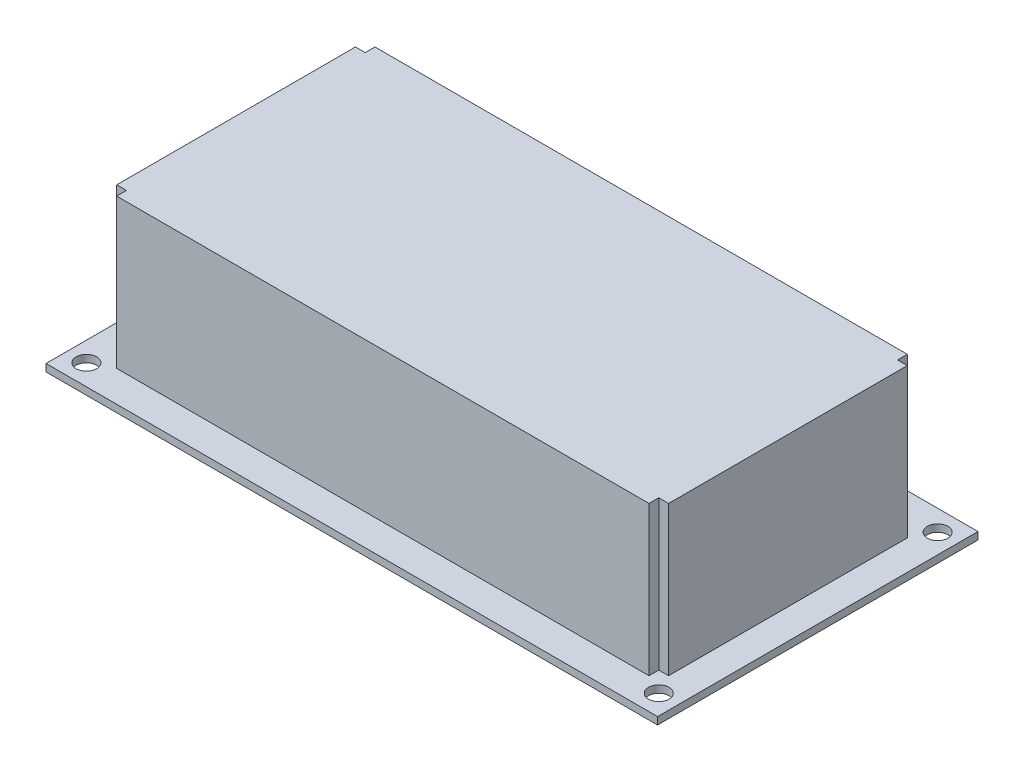
ISO-10303-21;
HEADER;
FILE_DESCRIPTION(('STEP AP214'),'2;1');
FILE_NAME('part.step','',(''),(''),'','','');
FILE_SCHEMA(('AUTOMOTIVE_DESIGN { 1 0 10303 214 1 1 1 1 }'));
ENDSEC;
DATA;
#1=APPLICATION_CONTEXT('core data for automotive mechanical design processes');
#2=APPLICATION_PROTOCOL_DEFINITION('international standard','automotive_design',2000,#1);
#3=PRODUCT_CONTEXT('',#1,'mechanical');
#4=PRODUCT('Part','Part','',(#3));
#5=PRODUCT_RELATED_PRODUCT_CATEGORY('part','',(#4));
#6=PRODUCT_DEFINITION_FORMATION('','',#4);
#7=PRODUCT_DEFINITION_CONTEXT('part definition',#1,'design');
#8=PRODUCT_DEFINITION('design','',#6,#7);
#9=PRODUCT_DEFINITION_SHAPE('','',#8);
#10=(LENGTH_UNIT() NAMED_UNIT(*) SI_UNIT(.MILLI.,.METRE.));
#11=(NAMED_UNIT(*) PLANE_ANGLE_UNIT() SI_UNIT($,.RADIAN.));
#12=(NAMED_UNIT(*) SI_UNIT($,.STERADIAN.) SOLID_ANGLE_UNIT());
#13=UNCERTAINTY_MEASURE_WITH_UNIT(LENGTH_MEASURE(1.E-05),#10,'distance_accuracy_value','');
#14=(GEOMETRIC_REPRESENTATION_CONTEXT(3) GLOBAL_UNCERTAINTY_ASSIGNED_CONTEXT((#13)) GLOBAL_UNIT_ASSIGNED_CONTEXT((#10,
#11,#12)) REPRESENTATION_CONTEXT('',''));
#15=CARTESIAN_POINT('',(0.,0.,0.));
#16=DIRECTION('',(0.,0.,1.));
#17=DIRECTION('',(1.,0.,0.));
#18=AXIS2_PLACEMENT_3D('',#15,#16,#17);
#19=CARTESIAN_POINT('',(0.,1.5,0.));
#20=DIRECTION('',(0.,-1.,0.));
#21=DIRECTION('',(0.,0.,-1.));
#22=AXIS2_PLACEMENT_3D('',#19,#20,#21);
#23=PLANE('',#22);
#24=CARTESIAN_POINT('',(-58.5,1.5,28.5));
#25=DIRECTION('',(0.,1.,0.));
#26=DIRECTION('',(0.,0.,1.));
#27=AXIS2_PLACEMENT_3D('',#24,#25,#26);
#28=CIRCLE('',#27,2.1);
#29=CARTESIAN_POINT('',(-58.5,1.5,30.6));
#30=VERTEX_POINT('',#29);
#31=EDGE_CURVE('E169',#30,#30,#28,.T.);
#32=ORIENTED_EDGE('',*,*,#31,.F.);
#33=EDGE_LOOP('',(#32));
#34=FACE_BOUND('',#33,.T.);
#35=CARTESIAN_POINT('',(58.5,1.5,28.5));
#36=DIRECTION('',(0.,1.,0.));
#37=DIRECTION('',(0.,0.,1.));
#38=AXIS2_PLACEMENT_3D('',#35,#36,#37);
#39=CIRCLE('',#38,2.1);
#40=CARTESIAN_POINT('',(58.5,1.5,30.6));
#41=VERTEX_POINT('',#40);
#42=EDGE_CURVE('E192',#41,#41,#39,.T.);
#43=ORIENTED_EDGE('',*,*,#42,.F.);
#44=EDGE_LOOP('',(#43));
#45=FACE_BOUND('',#44,.T.);
#46=DIRECTION('',(0.,0.,-1.));
#47=VECTOR('',#46,1.);
#48=CARTESIAN_POINT('',(62.5,1.5,32.75));
#49=LINE('',#48,#47);
#50=CARTESIAN_POINT('',(62.5,1.5,32.75));
#51=VERTEX_POINT('',#50);
#52=CARTESIAN_POINT('',(62.5,1.5,-32.75));
#53=VERTEX_POINT('',#52);
#54=EDGE_CURVE('E199',#51,#53,#49,.T.);
#55=ORIENTED_EDGE('',*,*,#54,.T.);
#56=DIRECTION('',(-1.,0.,0.));
#57=VECTOR('',#56,1.);
#58=CARTESIAN_POINT('',(-62.5,1.5,-32.75));
#59=LINE('',#58,#57);
#60=CARTESIAN_POINT('',(-62.5,1.5,-32.75));
#61=VERTEX_POINT('',#60);
#62=EDGE_CURVE('E202',#53,#61,#59,.T.);
#63=ORIENTED_EDGE('',*,*,#62,.T.);
#64=DIRECTION('',(0.,0.,1.));
#65=VECTOR('',#64,1.);
#66=CARTESIAN_POINT('',(-62.5,1.5,32.75));
#67=LINE('',#66,#65);
#68=CARTESIAN_POINT('',(-62.5,1.5,32.75));
#69=VERTEX_POINT('',#68);
#70=EDGE_CURVE('E205',#61,#69,#67,.T.);
#71=ORIENTED_EDGE('',*,*,#70,.T.);
#72=DIRECTION('',(1.,0.,0.));
#73=VECTOR('',#72,1.);
#74=CARTESIAN_POINT('',(-62.5,1.5,32.75));
#75=LINE('',#74,#73);
#76=EDGE_CURVE('E207',#69,#51,#75,.T.);
#77=ORIENTED_EDGE('',*,*,#76,.T.);
#78=EDGE_LOOP('',(#55,#63,#71,#77));
#79=FACE_BOUND('',#78,.T.);
#80=CARTESIAN_POINT('',(58.5,1.5,-28.5));
#81=DIRECTION('',(0.,1.,0.));
#82=DIRECTION('',(0.,0.,1.));
#83=AXIS2_PLACEMENT_3D('',#80,#81,#82);
#84=CIRCLE('',#83,2.1);
#85=CARTESIAN_POINT('',(58.5,1.5,-26.4));
#86=VERTEX_POINT('',#85);
#87=EDGE_CURVE('E186',#86,#86,#84,.T.);
#88=ORIENTED_EDGE('',*,*,#87,.F.);
#89=EDGE_LOOP('',(#88));
#90=FACE_BOUND('',#89,.T.);
#91=CARTESIAN_POINT('',(-58.5,1.5,-28.5));
#92=DIRECTION('',(0.,1.,0.));
#93=DIRECTION('',(0.,0.,1.));
#94=AXIS2_PLACEMENT_3D('',#91,#92,#93);
#95=CIRCLE('',#94,2.1);
#96=CARTESIAN_POINT('',(-58.5,1.5,-26.4));
#97=VERTEX_POINT('',#96);
#98=EDGE_CURVE('E180',#97,#97,#95,.T.);
#99=ORIENTED_EDGE('',*,*,#98,.F.);
#100=EDGE_LOOP('',(#99));
#101=FACE_BOUND('',#100,.T.);
#102=DIRECTION('',(0.,0.,-1.));
#103=VECTOR('',#102,1.);
#104=CARTESIAN_POINT('',(56.4,1.5,24.4));
#105=LINE('',#104,#103);
#106=CARTESIAN_POINT('',(56.4,1.5,24.4));
#107=VERTEX_POINT('',#106);
#108=CARTESIAN_POINT('',(56.4,1.5,-24.4));
#109=VERTEX_POINT('',#108);
#110=EDGE_CURVE('E168',#107,#109,#105,.T.);
#111=ORIENTED_EDGE('',*,*,#110,.F.);
#112=DIRECTION('',(1.,0.,0.));
#113=VECTOR('',#112,1.);
#114=CARTESIAN_POINT('',(56.4,1.5,24.4));
#115=LINE('',#114,#113);
#116=CARTESIAN_POINT('',(54.4,1.5,24.4));
#117=VERTEX_POINT('',#116);
#118=EDGE_CURVE('E165',#117,#107,#115,.T.);
#119=ORIENTED_EDGE('',*,*,#118,.F.);
#120=DIRECTION('',(0.,0.,-1.));
#121=VECTOR('',#120,1.);
#122=CARTESIAN_POINT('',(54.4,1.5,24.4));
#123=LINE('',#122,#121);
#124=CARTESIAN_POINT('',(54.4,1.5,26.4));
#125=VERTEX_POINT('',#124);
#126=EDGE_CURVE('E463',#125,#117,#123,.T.);
#127=ORIENTED_EDGE('',*,*,#126,.F.);
#128=DIRECTION('',(1.,0.,0.));
#129=VECTOR('',#128,1.);
#130=CARTESIAN_POINT('',(-54.4,1.5,26.4));
#131=LINE('',#130,#129);
#132=CARTESIAN_POINT('',(-54.4,1.5,26.4));
#133=VERTEX_POINT('',#132);
#134=EDGE_CURVE('E518',#133,#125,#131,.T.);
#135=ORIENTED_EDGE('',*,*,#134,.F.);
#136=DIRECTION('',(0.,0.,1.));
#137=VECTOR('',#136,1.);
#138=CARTESIAN_POINT('',(-54.4,1.5,24.4));
#139=LINE('',#138,#137);
#140=CARTESIAN_POINT('',(-54.4,1.5,24.4));
#141=VERTEX_POINT('',#140);
#142=EDGE_CURVE('E515',#141,#133,#139,.T.);
#143=ORIENTED_EDGE('',*,*,#142,.F.);
#144=DIRECTION('',(1.,0.,0.));
#145=VECTOR('',#144,1.);
#146=CARTESIAN_POINT('',(-56.4,1.5,24.4));
#147=LINE('',#146,#145);
#148=CARTESIAN_POINT('',(-56.4,1.5,24.4));
#149=VERTEX_POINT('',#148);
#150=EDGE_CURVE('E512',#149,#141,#147,.T.);
#151=ORIENTED_EDGE('',*,*,#150,.F.);
#152=DIRECTION('',(0.,0.,1.));
#153=VECTOR('',#152,1.);
#154=CARTESIAN_POINT('',(-56.4,1.5,24.4));
#155=LINE('',#154,#153);
#156=CARTESIAN_POINT('',(-56.4,1.5,-24.4));
#157=VERTEX_POINT('',#156);
#158=EDGE_CURVE('E509',#157,#149,#155,.T.);
#159=ORIENTED_EDGE('',*,*,#158,.F.);
#160=DIRECTION('',(-1.,0.,0.));
#161=VECTOR('',#160,1.);
#162=CARTESIAN_POINT('',(-56.4,1.5,-24.4));
#163=LINE('',#162,#161);
#164=CARTESIAN_POINT('',(-54.4,1.5,-24.4));
#165=VERTEX_POINT('',#164);
#166=EDGE_CURVE('E506',#165,#157,#163,.T.);
#167=ORIENTED_EDGE('',*,*,#166,.F.);
#168=DIRECTION('',(0.,0.,1.));
#169=VECTOR('',#168,1.);
#170=CARTESIAN_POINT('',(-54.4,1.5,-24.4));
#171=LINE('',#170,#169);
#172=CARTESIAN_POINT('',(-54.4,1.5,-26.4));
#173=VERTEX_POINT('',#172);
#174=EDGE_CURVE('E499',#173,#165,#171,.T.);
#175=ORIENTED_EDGE('',*,*,#174,.F.);
#176=DIRECTION('',(-1.,0.,0.));
#177=VECTOR('',#176,1.);
#178=CARTESIAN_POINT('',(-54.4,1.5,-26.4));
#179=LINE('',#178,#177);
#180=CARTESIAN_POINT('',(54.4,1.5,-26.4));
#181=VERTEX_POINT('',#180);
#182=EDGE_CURVE('E496',#181,#173,#179,.T.);
#183=ORIENTED_EDGE('',*,*,#182,.F.);
#184=DIRECTION('',(0.,0.,-1.));
#185=VECTOR('',#184,1.);
#186=CARTESIAN_POINT('',(54.4,1.5,-24.4));
#187=LINE('',#186,#185);
#188=CARTESIAN_POINT('',(54.4,1.5,-24.4));
#189=VERTEX_POINT('',#188);
#190=EDGE_CURVE('E55',#189,#181,#187,.T.);
#191=ORIENTED_EDGE('',*,*,#190,.F.);
#192=DIRECTION('',(-1.,0.,0.));
#193=VECTOR('',#192,1.);
#194=CARTESIAN_POINT('',(56.4,1.5,-24.4));
#195=LINE('',#194,#193);
#196=EDGE_CURVE('E50',#109,#189,#195,.T.);
#197=ORIENTED_EDGE('',*,*,#196,.F.);
#198=EDGE_LOOP('',(#111,#119,#127,#135,#143,#151,#159,#167,#175,#183,#191,#197));
#199=FACE_BOUND('',#198,.T.);
#200=ADVANCED_FACE('F35',(#34,#45,#79,#90,#101,#199),#23,.F.);
#201=CARTESIAN_POINT('',(62.5,1.5,32.75));
#202=DIRECTION('',(-1.,0.,0.));
#203=DIRECTION('',(0.,0.,1.));
#204=AXIS2_PLACEMENT_3D('',#201,#202,#203);
#205=PLANE('',#204);
#206=DIRECTION('',(0.,0.,-1.));
#207=VECTOR('',#206,1.);
#208=CARTESIAN_POINT('',(62.5,0.,32.75));
#209=LINE('',#208,#207);
#210=CARTESIAN_POINT('',(62.5,0.,32.75));
#211=VERTEX_POINT('',#210);
#212=CARTESIAN_POINT('',(62.5,0.,-32.75));
#213=VERTEX_POINT('',#212);
#214=EDGE_CURVE('E198',#211,#213,#209,.T.);
#215=ORIENTED_EDGE('',*,*,#214,.T.);
#216=DIRECTION('',(0.,-1.,0.));
#217=VECTOR('',#216,1.);
#218=CARTESIAN_POINT('',(62.5,1.5,-32.75));
#219=LINE('',#218,#217);
#220=EDGE_CURVE('E11',#53,#213,#219,.T.);
#221=ORIENTED_EDGE('',*,*,#220,.F.);
#222=ORIENTED_EDGE('',*,*,#54,.F.);
#223=DIRECTION('',(0.,-1.,0.));
#224=VECTOR('',#223,1.);
#225=CARTESIAN_POINT('',(62.5,1.5,32.75));
#226=LINE('',#225,#224);
#227=EDGE_CURVE('E209',#51,#211,#226,.T.);
#228=ORIENTED_EDGE('',*,*,#227,.T.);
#229=EDGE_LOOP('',(#215,#221,#222,#228));
#230=FACE_BOUND('',#229,.T.);
#231=ADVANCED_FACE('F37',(#230),#205,.F.);
#232=CARTESIAN_POINT('',(-62.5,1.5,-32.75));
#233=DIRECTION('',(0.,0.,1.));
#234=DIRECTION('',(1.,0.,0.));
#235=AXIS2_PLACEMENT_3D('',#232,#233,#234);
#236=PLANE('',#235);
#237=DIRECTION('',(-1.,0.,0.));
#238=VECTOR('',#237,1.);
#239=CARTESIAN_POINT('',(-62.5,0.,-32.75));
#240=LINE('',#239,#238);
#241=CARTESIAN_POINT('',(-62.5,0.,-32.75));
#242=VERTEX_POINT('',#241);
#243=EDGE_CURVE('E212',#213,#242,#240,.T.);
#244=ORIENTED_EDGE('',*,*,#243,.T.);
#245=DIRECTION('',(0.,-1.,0.));
#246=VECTOR('',#245,1.);
#247=CARTESIAN_POINT('',(-62.5,1.5,-32.75));
#248=LINE('',#247,#246);
#249=EDGE_CURVE('E43',#61,#242,#248,.T.);
#250=ORIENTED_EDGE('',*,*,#249,.F.);
#251=ORIENTED_EDGE('',*,*,#62,.F.);
#252=ORIENTED_EDGE('',*,*,#220,.T.);
#253=EDGE_LOOP('',(#244,#250,#251,#252));
#254=FACE_BOUND('',#253,.T.);
#255=ADVANCED_FACE('F242',(#254),#236,.F.);
#256=CARTESIAN_POINT('',(-62.5,1.5,32.75));
#257=DIRECTION('',(1.,0.,0.));
#258=DIRECTION('',(0.,0.,-1.));
#259=AXIS2_PLACEMENT_3D('',#256,#257,#258);
#260=PLANE('',#259);
#261=DIRECTION('',(0.,0.,1.));
#262=VECTOR('',#261,1.);
#263=CARTESIAN_POINT('',(-62.5,0.,32.75));
#264=LINE('',#263,#262);
#265=CARTESIAN_POINT('',(-62.5,0.,32.75));
#266=VERTEX_POINT('',#265);
#267=EDGE_CURVE('E214',#242,#266,#264,.T.);
#268=ORIENTED_EDGE('',*,*,#267,.T.);
#269=DIRECTION('',(0.,-1.,0.));
#270=VECTOR('',#269,1.);
#271=CARTESIAN_POINT('',(-62.5,1.5,32.75));
#272=LINE('',#271,#270);
#273=EDGE_CURVE('E219',#69,#266,#272,.T.);
#274=ORIENTED_EDGE('',*,*,#273,.F.);
#275=ORIENTED_EDGE('',*,*,#70,.F.);
#276=ORIENTED_EDGE('',*,*,#249,.T.);
#277=EDGE_LOOP('',(#268,#274,#275,#276));
#278=FACE_BOUND('',#277,.T.);
#279=ADVANCED_FACE('F226',(#278),#260,.F.);
#280=CARTESIAN_POINT('',(-62.5,1.5,32.75));
#281=DIRECTION('',(0.,0.,-1.));
#282=DIRECTION('',(-1.,0.,0.));
#283=AXIS2_PLACEMENT_3D('',#280,#281,#282);
#284=PLANE('',#283);
#285=DIRECTION('',(1.,0.,0.));
#286=VECTOR('',#285,1.);
#287=CARTESIAN_POINT('',(-62.5,0.,32.75));
#288=LINE('',#287,#286);
#289=EDGE_CURVE('E203',#266,#211,#288,.T.);
#290=ORIENTED_EDGE('',*,*,#289,.T.);
#291=ORIENTED_EDGE('',*,*,#227,.F.);
#292=ORIENTED_EDGE('',*,*,#76,.F.);
#293=ORIENTED_EDGE('',*,*,#273,.T.);
#294=EDGE_LOOP('',(#290,#291,#292,#293));
#295=FACE_BOUND('',#294,.T.);
#296=ADVANCED_FACE('F235',(#295),#284,.F.);
#297=CARTESIAN_POINT('',(0.,0.,0.));
#298=DIRECTION('',(0.,-1.,0.));
#299=DIRECTION('',(0.,0.,-1.));
#300=AXIS2_PLACEMENT_3D('',#297,#298,#299);
#301=PLANE('',#300);
#302=CARTESIAN_POINT('',(-58.5,0.,28.5));
#303=DIRECTION('',(0.,-1.,0.));
#304=DIRECTION('',(0.,0.,-1.));
#305=AXIS2_PLACEMENT_3D('',#302,#303,#304);
#306=CIRCLE('',#305,2.1);
#307=CARTESIAN_POINT('',(-58.5,0.,26.4));
#308=VERTEX_POINT('',#307);
#309=EDGE_CURVE('E172',#308,#308,#306,.T.);
#310=ORIENTED_EDGE('',*,*,#309,.F.);
#311=EDGE_LOOP('',(#310));
#312=FACE_BOUND('',#311,.T.);
#313=CARTESIAN_POINT('',(-58.5,0.,-28.5));
#314=DIRECTION('',(0.,-1.,0.));
#315=DIRECTION('',(0.,0.,-1.));
#316=AXIS2_PLACEMENT_3D('',#313,#314,#315);
#317=CIRCLE('',#316,2.1);
#318=CARTESIAN_POINT('',(-58.5,0.,-30.6));
#319=VERTEX_POINT('',#318);
#320=EDGE_CURVE('E183',#319,#319,#317,.T.);
#321=ORIENTED_EDGE('',*,*,#320,.F.);
#322=EDGE_LOOP('',(#321));
#323=FACE_BOUND('',#322,.T.);
#324=CARTESIAN_POINT('',(58.5,0.,-28.5));
#325=DIRECTION('',(0.,-1.,0.));
#326=DIRECTION('',(0.,0.,-1.));
#327=AXIS2_PLACEMENT_3D('',#324,#325,#326);
#328=CIRCLE('',#327,2.1);
#329=CARTESIAN_POINT('',(58.5,0.,-30.6));
#330=VERTEX_POINT('',#329);
#331=EDGE_CURVE('E189',#330,#330,#328,.T.);
#332=ORIENTED_EDGE('',*,*,#331,.F.);
#333=EDGE_LOOP('',(#332));
#334=FACE_BOUND('',#333,.T.);
#335=CARTESIAN_POINT('',(58.5,0.,28.5));
#336=DIRECTION('',(0.,-1.,0.));
#337=DIRECTION('',(0.,0.,-1.));
#338=AXIS2_PLACEMENT_3D('',#335,#336,#337);
#339=CIRCLE('',#338,2.1);
#340=CARTESIAN_POINT('',(58.5,0.,26.4));
#341=VERTEX_POINT('',#340);
#342=EDGE_CURVE('E195',#341,#341,#339,.T.);
#343=ORIENTED_EDGE('',*,*,#342,.F.);
#344=EDGE_LOOP('',(#343));
#345=FACE_BOUND('',#344,.T.);
#346=ORIENTED_EDGE('',*,*,#214,.F.);
#347=ORIENTED_EDGE('',*,*,#289,.F.);
#348=ORIENTED_EDGE('',*,*,#267,.F.);
#349=ORIENTED_EDGE('',*,*,#243,.F.);
#350=EDGE_LOOP('',(#346,#347,#348,#349));
#351=FACE_BOUND('',#350,.T.);
#352=ADVANCED_FACE('F232',(#312,#323,#334,#345,#351),#301,.T.);
#353=CARTESIAN_POINT('',(58.5,1.5,28.5));
#354=DIRECTION('',(0.,1.,0.));
#355=DIRECTION('',(0.,0.,1.));
#356=AXIS2_PLACEMENT_3D('',#353,#354,#355);
#357=CYLINDRICAL_SURFACE('',#356,2.1);
#358=ORIENTED_EDGE('',*,*,#42,.T.);
#359=EDGE_LOOP('',(#358));
#360=FACE_BOUND('',#359,.T.);
#361=ORIENTED_EDGE('',*,*,#342,.T.);
#362=EDGE_LOOP('',(#361));
#363=FACE_BOUND('',#362,.T.);
#364=ADVANCED_FACE('F258',(#360,#363),#357,.F.);
#365=CARTESIAN_POINT('',(58.5,1.5,-28.5));
#366=DIRECTION('',(0.,1.,0.));
#367=DIRECTION('',(0.,0.,1.));
#368=AXIS2_PLACEMENT_3D('',#365,#366,#367);
#369=CYLINDRICAL_SURFACE('',#368,2.1);
#370=ORIENTED_EDGE('',*,*,#87,.T.);
#371=EDGE_LOOP('',(#370));
#372=FACE_BOUND('',#371,.T.);
#373=ORIENTED_EDGE('',*,*,#331,.T.);
#374=EDGE_LOOP('',(#373));
#375=FACE_BOUND('',#374,.T.);
#376=ADVANCED_FACE('F278',(#372,#375),#369,.F.);
#377=CARTESIAN_POINT('',(-58.5,1.5,-28.5));
#378=DIRECTION('',(0.,1.,0.));
#379=DIRECTION('',(0.,0.,1.));
#380=AXIS2_PLACEMENT_3D('',#377,#378,#379);
#381=CYLINDRICAL_SURFACE('',#380,2.1);
#382=ORIENTED_EDGE('',*,*,#98,.T.);
#383=EDGE_LOOP('',(#382));
#384=FACE_BOUND('',#383,.T.);
#385=ORIENTED_EDGE('',*,*,#320,.T.);
#386=EDGE_LOOP('',(#385));
#387=FACE_BOUND('',#386,.T.);
#388=ADVANCED_FACE('F285',(#384,#387),#381,.F.);
#389=CARTESIAN_POINT('',(-58.5,1.5,28.5));
#390=DIRECTION('',(0.,1.,0.));
#391=DIRECTION('',(0.,0.,1.));
#392=AXIS2_PLACEMENT_3D('',#389,#390,#391);
#393=CYLINDRICAL_SURFACE('',#392,2.1);
#394=ORIENTED_EDGE('',*,*,#31,.T.);
#395=EDGE_LOOP('',(#394));
#396=FACE_BOUND('',#395,.T.);
#397=ORIENTED_EDGE('',*,*,#309,.T.);
#398=EDGE_LOOP('',(#397));
#399=FACE_BOUND('',#398,.T.);
#400=ADVANCED_FACE('F292',(#396,#399),#393,.F.);
#401=CARTESIAN_POINT('',(56.4,32.,24.4));
#402=DIRECTION('',(-1.,0.,0.));
#403=DIRECTION('',(0.,0.,1.));
#404=AXIS2_PLACEMENT_3D('',#401,#402,#403);
#405=PLANE('',#404);
#406=ORIENTED_EDGE('',*,*,#110,.T.);
#407=DIRECTION('',(0.,-1.,0.));
#408=VECTOR('',#407,1.);
#409=CARTESIAN_POINT('',(56.4,32.,-24.4));
#410=LINE('',#409,#408);
#411=CARTESIAN_POINT('',(56.4,32.,-24.4));
#412=VERTEX_POINT('',#411);
#413=EDGE_CURVE('E149',#412,#109,#410,.T.);
#414=ORIENTED_EDGE('',*,*,#413,.F.);
#415=DIRECTION('',(0.,0.,-1.));
#416=VECTOR('',#415,1.);
#417=CARTESIAN_POINT('',(56.4,32.,24.4));
#418=LINE('',#417,#416);
#419=CARTESIAN_POINT('',(56.4,32.,24.4));
#420=VERTEX_POINT('',#419);
#421=EDGE_CURVE('E156',#420,#412,#418,.T.);
#422=ORIENTED_EDGE('',*,*,#421,.F.);
#423=DIRECTION('',(0.,-1.,0.));
#424=VECTOR('',#423,1.);
#425=CARTESIAN_POINT('',(56.4,32.,24.4));
#426=LINE('',#425,#424);
#427=EDGE_CURVE('E459',#420,#107,#426,.T.);
#428=ORIENTED_EDGE('',*,*,#427,.T.);
#429=EDGE_LOOP('',(#406,#414,#422,#428));
#430=FACE_BOUND('',#429,.T.);
#431=ADVANCED_FACE('F167',(#430),#405,.F.);
#432=CARTESIAN_POINT('',(56.4,32.,-24.4));
#433=DIRECTION('',(0.,0.,1.));
#434=DIRECTION('',(1.,0.,0.));
#435=AXIS2_PLACEMENT_3D('',#432,#433,#434);
#436=PLANE('',#435);
#437=ORIENTED_EDGE('',*,*,#196,.T.);
#438=DIRECTION('',(0.,-1.,0.));
#439=VECTOR('',#438,1.);
#440=CARTESIAN_POINT('',(54.4,32.,-24.4));
#441=LINE('',#440,#439);
#442=CARTESIAN_POINT('',(54.4,32.,-24.4));
#443=VERTEX_POINT('',#442);
#444=EDGE_CURVE('E152',#443,#189,#441,.T.);
#445=ORIENTED_EDGE('',*,*,#444,.F.);
#446=DIRECTION('',(-1.,0.,0.));
#447=VECTOR('',#446,1.);
#448=CARTESIAN_POINT('',(56.4,32.,-24.4));
#449=LINE('',#448,#447);
#450=EDGE_CURVE('E145',#412,#443,#449,.T.);
#451=ORIENTED_EDGE('',*,*,#450,.F.);
#452=ORIENTED_EDGE('',*,*,#413,.T.);
#453=EDGE_LOOP('',(#437,#445,#451,#452));
#454=FACE_BOUND('',#453,.T.);
#455=ADVANCED_FACE('F147',(#454),#436,.F.);
#456=CARTESIAN_POINT('',(54.4,32.,-24.4));
#457=DIRECTION('',(-1.,0.,0.));
#458=DIRECTION('',(0.,0.,1.));
#459=AXIS2_PLACEMENT_3D('',#456,#457,#458);
#460=PLANE('',#459);
#461=ORIENTED_EDGE('',*,*,#190,.T.);
#462=DIRECTION('',(0.,-1.,0.));
#463=VECTOR('',#462,1.);
#464=CARTESIAN_POINT('',(54.4,32.,-26.4));
#465=LINE('',#464,#463);
#466=CARTESIAN_POINT('',(54.4,32.,-26.4));
#467=VERTEX_POINT('',#466);
#468=EDGE_CURVE('E174',#467,#181,#465,.T.);
#469=ORIENTED_EDGE('',*,*,#468,.F.);
#470=DIRECTION('',(0.,0.,-1.));
#471=VECTOR('',#470,1.);
#472=CARTESIAN_POINT('',(54.4,32.,-24.4));
#473=LINE('',#472,#471);
#474=EDGE_CURVE('E155',#443,#467,#473,.T.);
#475=ORIENTED_EDGE('',*,*,#474,.F.);
#476=ORIENTED_EDGE('',*,*,#444,.T.);
#477=EDGE_LOOP('',(#461,#469,#475,#476));
#478=FACE_BOUND('',#477,.T.);
#479=ADVANCED_FACE('F313',(#478),#460,.F.);
#480=CARTESIAN_POINT('',(-54.4,32.,-26.4));
#481=DIRECTION('',(0.,0.,1.));
#482=DIRECTION('',(1.,0.,0.));
#483=AXIS2_PLACEMENT_3D('',#480,#481,#482);
#484=PLANE('',#483);
#485=ORIENTED_EDGE('',*,*,#182,.T.);
#486=DIRECTION('',(0.,-1.,0.));
#487=VECTOR('',#486,1.);
#488=CARTESIAN_POINT('',(-54.4,32.,-26.4));
#489=LINE('',#488,#487);
#490=CARTESIAN_POINT('',(-54.4,32.,-26.4));
#491=VERTEX_POINT('',#490);
#492=EDGE_CURVE('E489',#491,#173,#489,.T.);
#493=ORIENTED_EDGE('',*,*,#492,.F.);
#494=DIRECTION('',(-1.,0.,0.));
#495=VECTOR('',#494,1.);
#496=CARTESIAN_POINT('',(-54.4,32.,-26.4));
#497=LINE('',#496,#495);
#498=EDGE_CURVE('E497',#467,#491,#497,.T.);
#499=ORIENTED_EDGE('',*,*,#498,.F.);
#500=ORIENTED_EDGE('',*,*,#468,.T.);
#501=EDGE_LOOP('',(#485,#493,#499,#500));
#502=FACE_BOUND('',#501,.T.);
#503=ADVANCED_FACE('F320',(#502),#484,.F.);
#504=CARTESIAN_POINT('',(-54.4,32.,-24.4));
#505=DIRECTION('',(1.,0.,0.));
#506=DIRECTION('',(0.,0.,-1.));
#507=AXIS2_PLACEMENT_3D('',#504,#505,#506);
#508=PLANE('',#507);
#509=ORIENTED_EDGE('',*,*,#174,.T.);
#510=DIRECTION('',(0.,-1.,0.));
#511=VECTOR('',#510,1.);
#512=CARTESIAN_POINT('',(-54.4,32.,-24.4));
#513=LINE('',#512,#511);
#514=CARTESIAN_POINT('',(-54.4,32.,-24.4));
#515=VERTEX_POINT('',#514);
#516=EDGE_CURVE('E486',#515,#165,#513,.T.);
#517=ORIENTED_EDGE('',*,*,#516,.F.);
#518=DIRECTION('',(0.,0.,1.));
#519=VECTOR('',#518,1.);
#520=CARTESIAN_POINT('',(-54.4,32.,-24.4));
#521=LINE('',#520,#519);
#522=EDGE_CURVE('E538',#491,#515,#521,.T.);
#523=ORIENTED_EDGE('',*,*,#522,.F.);
#524=ORIENTED_EDGE('',*,*,#492,.T.);
#525=EDGE_LOOP('',(#509,#517,#523,#524));
#526=FACE_BOUND('',#525,.T.);
#527=ADVANCED_FACE('F328',(#526),#508,.F.);
#528=CARTESIAN_POINT('',(-56.4,32.,-24.4));
#529=DIRECTION('',(0.,0.,1.));
#530=DIRECTION('',(1.,0.,0.));
#531=AXIS2_PLACEMENT_3D('',#528,#529,#530);
#532=PLANE('',#531);
#533=ORIENTED_EDGE('',*,*,#166,.T.);
#534=DIRECTION('',(0.,-1.,0.));
#535=VECTOR('',#534,1.);
#536=CARTESIAN_POINT('',(-56.4,32.,-24.4));
#537=LINE('',#536,#535);
#538=CARTESIAN_POINT('',(-56.4,32.,-24.4));
#539=VERTEX_POINT('',#538);
#540=EDGE_CURVE('E483',#539,#157,#537,.T.);
#541=ORIENTED_EDGE('',*,*,#540,.F.);
#542=DIRECTION('',(-1.,0.,0.));
#543=VECTOR('',#542,1.);
#544=CARTESIAN_POINT('',(-56.4,32.,-24.4));
#545=LINE('',#544,#543);
#546=EDGE_CURVE('E536',#515,#539,#545,.T.);
#547=ORIENTED_EDGE('',*,*,#546,.F.);
#548=ORIENTED_EDGE('',*,*,#516,.T.);
#549=EDGE_LOOP('',(#533,#541,#547,#548));
#550=FACE_BOUND('',#549,.T.);
#551=ADVANCED_FACE('F336',(#550),#532,.F.);
#552=CARTESIAN_POINT('',(-56.4,32.,24.4));
#553=DIRECTION('',(1.,0.,0.));
#554=DIRECTION('',(0.,0.,-1.));
#555=AXIS2_PLACEMENT_3D('',#552,#553,#554);
#556=PLANE('',#555);
#557=ORIENTED_EDGE('',*,*,#158,.T.);
#558=DIRECTION('',(0.,-1.,0.));
#559=VECTOR('',#558,1.);
#560=CARTESIAN_POINT('',(-56.4,32.,24.4));
#561=LINE('',#560,#559);
#562=CARTESIAN_POINT('',(-56.4,32.,24.4));
#563=VERTEX_POINT('',#562);
#564=EDGE_CURVE('E480',#563,#149,#561,.T.);
#565=ORIENTED_EDGE('',*,*,#564,.F.);
#566=DIRECTION('',(0.,0.,1.));
#567=VECTOR('',#566,1.);
#568=CARTESIAN_POINT('',(-56.4,32.,24.4));
#569=LINE('',#568,#567);
#570=EDGE_CURVE('E532',#539,#563,#569,.T.);
#571=ORIENTED_EDGE('',*,*,#570,.F.);
#572=ORIENTED_EDGE('',*,*,#540,.T.);
#573=EDGE_LOOP('',(#557,#565,#571,#572));
#574=FACE_BOUND('',#573,.T.);
#575=ADVANCED_FACE('F344',(#574),#556,.F.);
#576=CARTESIAN_POINT('',(-56.4,32.,24.4));
#577=DIRECTION('',(0.,0.,-1.));
#578=DIRECTION('',(-1.,0.,0.));
#579=AXIS2_PLACEMENT_3D('',#576,#577,#578);
#580=PLANE('',#579);
#581=ORIENTED_EDGE('',*,*,#150,.T.);
#582=DIRECTION('',(0.,-1.,0.));
#583=VECTOR('',#582,1.);
#584=CARTESIAN_POINT('',(-54.4,32.,24.4));
#585=LINE('',#584,#583);
#586=CARTESIAN_POINT('',(-54.4,32.,24.4));
#587=VERTEX_POINT('',#586);
#588=EDGE_CURVE('E477',#587,#141,#585,.T.);
#589=ORIENTED_EDGE('',*,*,#588,.F.);
#590=DIRECTION('',(1.,0.,0.));
#591=VECTOR('',#590,1.);
#592=CARTESIAN_POINT('',(-56.4,32.,24.4));
#593=LINE('',#592,#591);
#594=EDGE_CURVE('E530',#563,#587,#593,.T.);
#595=ORIENTED_EDGE('',*,*,#594,.F.);
#596=ORIENTED_EDGE('',*,*,#564,.T.);
#597=EDGE_LOOP('',(#581,#589,#595,#596));
#598=FACE_BOUND('',#597,.T.);
#599=ADVANCED_FACE('F352',(#598),#580,.F.);
#600=CARTESIAN_POINT('',(-54.4,32.,24.4));
#601=DIRECTION('',(1.,0.,0.));
#602=DIRECTION('',(0.,0.,-1.));
#603=AXIS2_PLACEMENT_3D('',#600,#601,#602);
#604=PLANE('',#603);
#605=ORIENTED_EDGE('',*,*,#142,.T.);
#606=DIRECTION('',(0.,-1.,0.));
#607=VECTOR('',#606,1.);
#608=CARTESIAN_POINT('',(-54.4,32.,26.4));
#609=LINE('',#608,#607);
#610=CARTESIAN_POINT('',(-54.4,32.,26.4));
#611=VERTEX_POINT('',#610);
#612=EDGE_CURVE('E474',#611,#133,#609,.T.);
#613=ORIENTED_EDGE('',*,*,#612,.F.);
#614=DIRECTION('',(0.,0.,1.));
#615=VECTOR('',#614,1.);
#616=CARTESIAN_POINT('',(-54.4,32.,24.4));
#617=LINE('',#616,#615);
#618=EDGE_CURVE('E526',#587,#611,#617,.T.);
#619=ORIENTED_EDGE('',*,*,#618,.F.);
#620=ORIENTED_EDGE('',*,*,#588,.T.);
#621=EDGE_LOOP('',(#605,#613,#619,#620));
#622=FACE_BOUND('',#621,.T.);
#623=ADVANCED_FACE('F360',(#622),#604,.F.);
#624=CARTESIAN_POINT('',(-54.4,32.,26.4));
#625=DIRECTION('',(0.,0.,-1.));
#626=DIRECTION('',(-1.,0.,0.));
#627=AXIS2_PLACEMENT_3D('',#624,#625,#626);
#628=PLANE('',#627);
#629=ORIENTED_EDGE('',*,*,#134,.T.);
#630=DIRECTION('',(0.,-1.,0.));
#631=VECTOR('',#630,1.);
#632=CARTESIAN_POINT('',(54.4,32.,26.4));
#633=LINE('',#632,#631);
#634=CARTESIAN_POINT('',(54.4,32.,26.4));
#635=VERTEX_POINT('',#634);
#636=EDGE_CURVE('E466',#635,#125,#633,.T.);
#637=ORIENTED_EDGE('',*,*,#636,.F.);
#638=DIRECTION('',(1.,0.,0.));
#639=VECTOR('',#638,1.);
#640=CARTESIAN_POINT('',(-54.4,32.,26.4));
#641=LINE('',#640,#639);
#642=EDGE_CURVE('E524',#611,#635,#641,.T.);
#643=ORIENTED_EDGE('',*,*,#642,.F.);
#644=ORIENTED_EDGE('',*,*,#612,.T.);
#645=EDGE_LOOP('',(#629,#637,#643,#644));
#646=FACE_BOUND('',#645,.T.);
#647=ADVANCED_FACE('F368',(#646),#628,.F.);
#648=CARTESIAN_POINT('',(54.4,32.,24.4));
#649=DIRECTION('',(-1.,0.,0.));
#650=DIRECTION('',(0.,0.,1.));
#651=AXIS2_PLACEMENT_3D('',#648,#649,#650);
#652=PLANE('',#651);
#653=ORIENTED_EDGE('',*,*,#126,.T.);
#654=DIRECTION('',(0.,-1.,0.));
#655=VECTOR('',#654,1.);
#656=CARTESIAN_POINT('',(54.4,32.,24.4));
#657=LINE('',#656,#655);
#658=CARTESIAN_POINT('',(54.4,32.,24.4));
#659=VERTEX_POINT('',#658);
#660=EDGE_CURVE('E461',#659,#117,#657,.T.);
#661=ORIENTED_EDGE('',*,*,#660,.F.);
#662=DIRECTION('',(0.,0.,-1.));
#663=VECTOR('',#662,1.);
#664=CARTESIAN_POINT('',(54.4,32.,24.4));
#665=LINE('',#664,#663);
#666=EDGE_CURVE('E468',#635,#659,#665,.T.);
#667=ORIENTED_EDGE('',*,*,#666,.F.);
#668=ORIENTED_EDGE('',*,*,#636,.T.);
#669=EDGE_LOOP('',(#653,#661,#667,#668));
#670=FACE_BOUND('',#669,.T.);
#671=ADVANCED_FACE('F376',(#670),#652,.F.);
#672=CARTESIAN_POINT('',(56.4,32.,24.4));
#673=DIRECTION('',(0.,0.,-1.));
#674=DIRECTION('',(-1.,0.,0.));
#675=AXIS2_PLACEMENT_3D('',#672,#673,#674);
#676=PLANE('',#675);
#677=ORIENTED_EDGE('',*,*,#118,.T.);
#678=ORIENTED_EDGE('',*,*,#427,.F.);
#679=DIRECTION('',(1.,0.,0.));
#680=VECTOR('',#679,1.);
#681=CARTESIAN_POINT('',(56.4,32.,24.4));
#682=LINE('',#681,#680);
#683=EDGE_CURVE('E161',#659,#420,#682,.T.);
#684=ORIENTED_EDGE('',*,*,#683,.F.);
#685=ORIENTED_EDGE('',*,*,#660,.T.);
#686=EDGE_LOOP('',(#677,#678,#684,#685));
#687=FACE_BOUND('',#686,.T.);
#688=ADVANCED_FACE('F384',(#687),#676,.F.);
#689=CARTESIAN_POINT('',(0.,32.,0.));
#690=DIRECTION('',(0.,1.,0.));
#691=DIRECTION('',(0.,0.,1.));
#692=AXIS2_PLACEMENT_3D('',#689,#690,#691);
#693=PLANE('',#692);
#694=ORIENTED_EDGE('',*,*,#421,.T.);
#695=ORIENTED_EDGE('',*,*,#450,.T.);
#696=ORIENTED_EDGE('',*,*,#474,.T.);
#697=ORIENTED_EDGE('',*,*,#498,.T.);
#698=ORIENTED_EDGE('',*,*,#522,.T.);
#699=ORIENTED_EDGE('',*,*,#546,.T.);
#700=ORIENTED_EDGE('',*,*,#570,.T.);
#701=ORIENTED_EDGE('',*,*,#594,.T.);
#702=ORIENTED_EDGE('',*,*,#618,.T.);
#703=ORIENTED_EDGE('',*,*,#642,.T.);
#704=ORIENTED_EDGE('',*,*,#666,.T.);
#705=ORIENTED_EDGE('',*,*,#683,.T.);
#706=EDGE_LOOP('',(#694,#695,#696,#697,#698,#699,#700,#701,#702,#703,#704,#705));
#707=FACE_BOUND('',#706,.T.);
#708=ADVANCED_FACE('F159',(#707),#693,.T.);
#709=CLOSED_SHELL('',(#200,#231,#255,#279,#296,#352,#364,#376,#388,#400,#431,#455,#479,#503,
#527,#551,#575,#599,#623,#647,#671,#688,#708));
#710=MANIFOLD_SOLID_BREP('B2',#709);
#711=ADVANCED_BREP_SHAPE_REPRESENTATION('',(#18,#710),#14);
#712=SHAPE_DEFINITION_REPRESENTATION(#9,#711);
ENDSEC;
END-ISO-10303-21;
